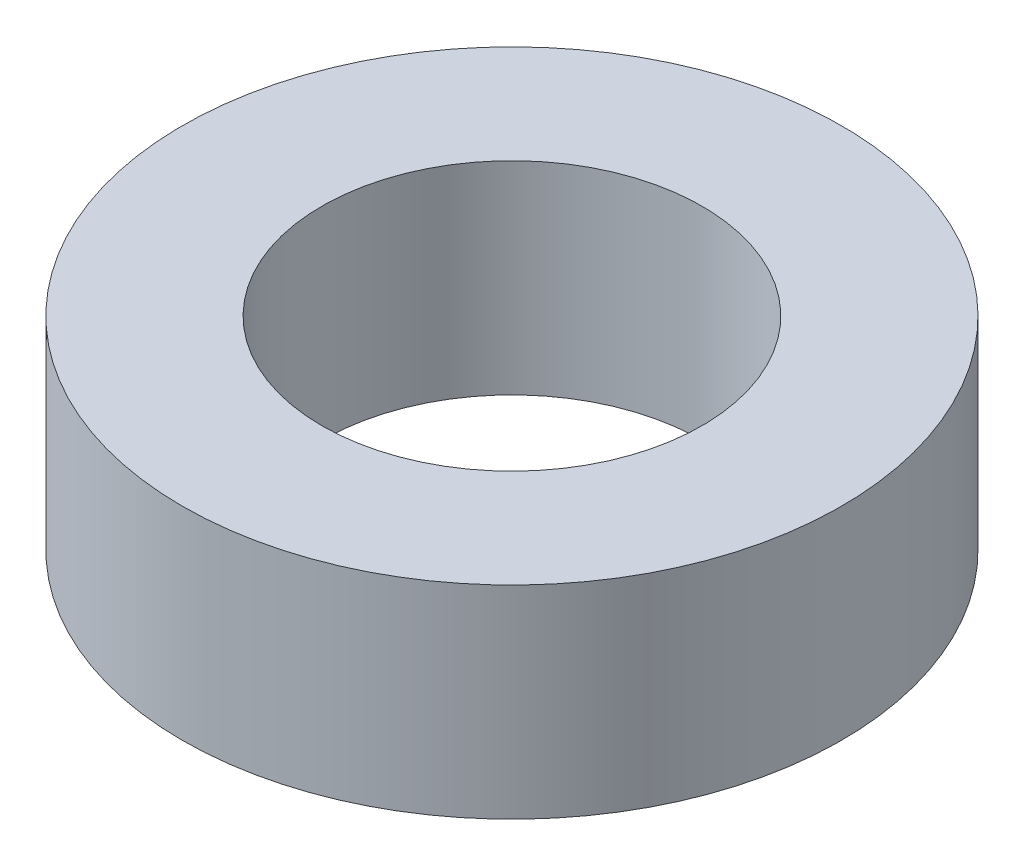
ISO-10303-21;
HEADER;
FILE_DESCRIPTION(('STEP AP214'),'2;1');
FILE_NAME('part.step','',(''),(''),'','','');
FILE_SCHEMA(('AUTOMOTIVE_DESIGN { 1 0 10303 214 1 1 1 1 }'));
ENDSEC;
DATA;
#1=APPLICATION_CONTEXT('core data for automotive mechanical design processes');
#2=APPLICATION_PROTOCOL_DEFINITION('international standard','automotive_design',2000,#1);
#3=PRODUCT_CONTEXT('',#1,'mechanical');
#4=PRODUCT('Part','Part','',(#3));
#5=PRODUCT_RELATED_PRODUCT_CATEGORY('part','',(#4));
#6=PRODUCT_DEFINITION_FORMATION('','',#4);
#7=PRODUCT_DEFINITION_CONTEXT('part definition',#1,'design');
#8=PRODUCT_DEFINITION('design','',#6,#7);
#9=PRODUCT_DEFINITION_SHAPE('','',#8);
#10=(LENGTH_UNIT() NAMED_UNIT(*) SI_UNIT(.MILLI.,.METRE.));
#11=(NAMED_UNIT(*) PLANE_ANGLE_UNIT() SI_UNIT($,.RADIAN.));
#12=(NAMED_UNIT(*) SI_UNIT($,.STERADIAN.) SOLID_ANGLE_UNIT());
#13=UNCERTAINTY_MEASURE_WITH_UNIT(LENGTH_MEASURE(1.E-05),#10,'distance_accuracy_value','');
#14=(GEOMETRIC_REPRESENTATION_CONTEXT(3) GLOBAL_UNCERTAINTY_ASSIGNED_CONTEXT((#13)) GLOBAL_UNIT_ASSIGNED_CONTEXT((#10,
#11,#12)) REPRESENTATION_CONTEXT('',''));
#15=CARTESIAN_POINT('',(0.,0.,0.));
#16=DIRECTION('',(0.,0.,1.));
#17=DIRECTION('',(1.,0.,0.));
#18=AXIS2_PLACEMENT_3D('',#15,#16,#17);
#19=CARTESIAN_POINT('',(0.,16.,0.));
#20=DIRECTION('',(0.,1.,0.));
#21=DIRECTION('',(0.,0.,1.));
#22=AXIS2_PLACEMENT_3D('',#19,#20,#21);
#23=PLANE('',#22);
#24=CARTESIAN_POINT('',(0.,16.,0.));
#25=DIRECTION('',(0.,1.,0.));
#26=DIRECTION('',(0.,0.,1.));
#27=AXIS2_PLACEMENT_3D('',#24,#25,#26);
#28=CIRCLE('',#27,26.);
#29=CARTESIAN_POINT('',(0.,16.,26.));
#30=VERTEX_POINT('',#29);
#31=EDGE_CURVE('E10',#30,#30,#28,.T.);
#32=ORIENTED_EDGE('',*,*,#31,.T.);
#33=EDGE_LOOP('',(#32));
#34=FACE_BOUND('',#33,.T.);
#35=CARTESIAN_POINT('',(0.,16.,0.));
#36=DIRECTION('',(0.,1.,0.));
#37=DIRECTION('',(0.,0.,1.));
#38=AXIS2_PLACEMENT_3D('',#35,#36,#37);
#39=CIRCLE('',#38,15.);
#40=CARTESIAN_POINT('',(0.,16.,15.));
#41=VERTEX_POINT('',#40);
#42=EDGE_CURVE('E42',#41,#41,#39,.T.);
#43=ORIENTED_EDGE('',*,*,#42,.F.);
#44=EDGE_LOOP('',(#43));
#45=FACE_BOUND('',#44,.T.);
#46=ADVANCED_FACE('F31',(#34,#45),#23,.T.);
#47=CARTESIAN_POINT('',(0.,0.,0.));
#48=DIRECTION('',(0.,1.,0.));
#49=DIRECTION('',(0.,0.,1.));
#50=AXIS2_PLACEMENT_3D('',#47,#48,#49);
#51=PLANE('',#50);
#52=CARTESIAN_POINT('',(0.,0.,0.));
#53=DIRECTION('',(0.,1.,0.));
#54=DIRECTION('',(0.,0.,1.));
#55=AXIS2_PLACEMENT_3D('',#52,#53,#54);
#56=CIRCLE('',#55,26.);
#57=CARTESIAN_POINT('',(0.,0.,26.));
#58=VERTEX_POINT('',#57);
#59=EDGE_CURVE('E35',#58,#58,#56,.T.);
#60=ORIENTED_EDGE('',*,*,#59,.F.);
#61=EDGE_LOOP('',(#60));
#62=FACE_BOUND('',#61,.T.);
#63=CARTESIAN_POINT('',(0.,0.,0.));
#64=DIRECTION('',(0.,1.,0.));
#65=DIRECTION('',(0.,0.,1.));
#66=AXIS2_PLACEMENT_3D('',#63,#64,#65);
#67=CIRCLE('',#66,15.);
#68=CARTESIAN_POINT('',(0.,0.,15.));
#69=VERTEX_POINT('',#68);
#70=EDGE_CURVE('E44',#69,#69,#67,.T.);
#71=ORIENTED_EDGE('',*,*,#70,.T.);
#72=EDGE_LOOP('',(#71));
#73=FACE_BOUND('',#72,.T.);
#74=ADVANCED_FACE('F54',(#62,#73),#51,.F.);
#75=CARTESIAN_POINT('',(0.,16.,0.));
#76=DIRECTION('',(0.,-1.,0.));
#77=DIRECTION('',(0.,0.,-1.));
#78=AXIS2_PLACEMENT_3D('',#75,#76,#77);
#79=CYLINDRICAL_SURFACE('',#78,26.);
#80=ORIENTED_EDGE('',*,*,#31,.F.);
#81=EDGE_LOOP('',(#80));
#82=FACE_BOUND('',#81,.T.);
#83=ORIENTED_EDGE('',*,*,#59,.T.);
#84=EDGE_LOOP('',(#83));
#85=FACE_BOUND('',#84,.T.);
#86=ADVANCED_FACE('F33',(#82,#85),#79,.T.);
#87=CARTESIAN_POINT('',(0.,16.,0.));
#88=DIRECTION('',(0.,-1.,0.));
#89=DIRECTION('',(0.,0.,-1.));
#90=AXIS2_PLACEMENT_3D('',#87,#88,#89);
#91=CYLINDRICAL_SURFACE('',#90,15.);
#92=ORIENTED_EDGE('',*,*,#42,.T.);
#93=EDGE_LOOP('',(#92));
#94=FACE_BOUND('',#93,.T.);
#95=ORIENTED_EDGE('',*,*,#70,.F.);
#96=EDGE_LOOP('',(#95));
#97=FACE_BOUND('',#96,.T.);
#98=ADVANCED_FACE('F50',(#94,#97),#91,.F.);
#99=CLOSED_SHELL('',(#46,#74,#86,#98));
#100=MANIFOLD_SOLID_BREP('B2',#99);
#101=ADVANCED_BREP_SHAPE_REPRESENTATION('',(#18,#100),#14);
#102=SHAPE_DEFINITION_REPRESENTATION(#9,#101);
ENDSEC;
END-ISO-10303-21;
